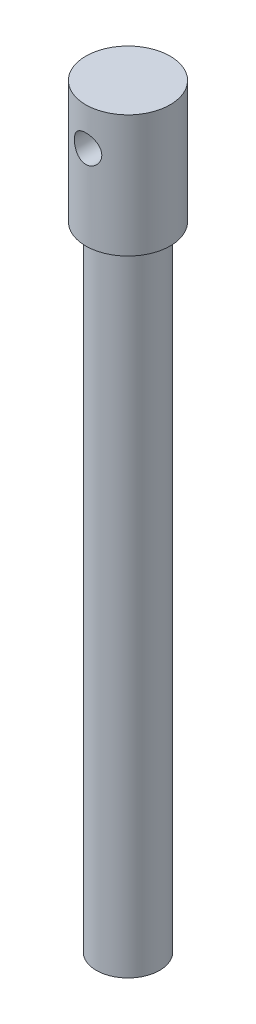
ISO-10303-21;
HEADER;
FILE_DESCRIPTION(('STEP AP214'),'2;1');
FILE_NAME('part.step','',(''),(''),'','','');
FILE_SCHEMA(('AUTOMOTIVE_DESIGN { 1 0 10303 214 1 1 1 1 }'));
ENDSEC;
DATA;
#1=APPLICATION_CONTEXT('core data for automotive mechanical design processes');
#2=APPLICATION_PROTOCOL_DEFINITION('international standard','automotive_design',2000,#1);
#3=PRODUCT_CONTEXT('',#1,'mechanical');
#4=PRODUCT('Part','Part','',(#3));
#5=PRODUCT_RELATED_PRODUCT_CATEGORY('part','',(#4));
#6=PRODUCT_DEFINITION_FORMATION('','',#4);
#7=PRODUCT_DEFINITION_CONTEXT('part definition',#1,'design');
#8=PRODUCT_DEFINITION('design','',#6,#7);
#9=PRODUCT_DEFINITION_SHAPE('','',#8);
#10=(LENGTH_UNIT() NAMED_UNIT(*) SI_UNIT(.MILLI.,.METRE.));
#11=(NAMED_UNIT(*) PLANE_ANGLE_UNIT() SI_UNIT($,.RADIAN.));
#12=(NAMED_UNIT(*) SI_UNIT($,.STERADIAN.) SOLID_ANGLE_UNIT());
#13=UNCERTAINTY_MEASURE_WITH_UNIT(LENGTH_MEASURE(1.E-05),#10,'distance_accuracy_value','');
#14=(GEOMETRIC_REPRESENTATION_CONTEXT(3) GLOBAL_UNCERTAINTY_ASSIGNED_CONTEXT((#13)) GLOBAL_UNIT_ASSIGNED_CONTEXT((#10,
#11,#12)) REPRESENTATION_CONTEXT('',''));
#15=CARTESIAN_POINT('',(0.,0.,0.));
#16=DIRECTION('',(0.,0.,1.));
#17=DIRECTION('',(1.,0.,0.));
#18=AXIS2_PLACEMENT_3D('',#15,#16,#17);
#19=CARTESIAN_POINT('',(0.,150.,0.));
#20=DIRECTION('',(0.,-1.,0.));
#21=DIRECTION('',(0.,0.,-1.));
#22=AXIS2_PLACEMENT_3D('',#19,#20,#21);
#23=CYLINDRICAL_SURFACE('',#22,7.5);
#24=CARTESIAN_POINT('',(0.,150.,0.));
#25=DIRECTION('',(0.,1.,0.));
#26=DIRECTION('',(0.,0.,1.));
#27=AXIS2_PLACEMENT_3D('',#24,#25,#26);
#28=CIRCLE('',#27,7.5);
#29=CARTESIAN_POINT('',(0.,150.,7.5));
#30=VERTEX_POINT('',#29);
#31=EDGE_CURVE('E54',#30,#30,#28,.T.);
#32=ORIENTED_EDGE('',*,*,#31,.F.);
#33=EDGE_LOOP('',(#32));
#34=FACE_BOUND('',#33,.T.);
#35=CARTESIAN_POINT('',(0.,0.,0.));
#36=DIRECTION('',(0.,1.,0.));
#37=DIRECTION('',(0.,0.,1.));
#38=AXIS2_PLACEMENT_3D('',#35,#36,#37);
#39=CIRCLE('',#38,7.5);
#40=CARTESIAN_POINT('',(0.,0.,7.5));
#41=VERTEX_POINT('',#40);
#42=EDGE_CURVE('E59',#41,#41,#39,.T.);
#43=ORIENTED_EDGE('',*,*,#42,.T.);
#44=EDGE_LOOP('',(#43));
#45=FACE_BOUND('',#44,.T.);
#46=ADVANCED_FACE('F37',(#34,#45),#23,.T.);
#47=CARTESIAN_POINT('',(0.,0.,0.));
#48=DIRECTION('',(0.,1.,0.));
#49=DIRECTION('',(0.,0.,1.));
#50=AXIS2_PLACEMENT_3D('',#47,#48,#49);
#51=PLANE('',#50);
#52=ORIENTED_EDGE('',*,*,#42,.F.);
#53=EDGE_LOOP('',(#52));
#54=FACE_BOUND('',#53,.T.);
#55=ADVANCED_FACE('F84',(#54),#51,.F.);
#56=CARTESIAN_POINT('',(0.,179.,0.));
#57=DIRECTION('',(0.,-1.,0.));
#58=DIRECTION('',(0.,0.,-1.));
#59=AXIS2_PLACEMENT_3D('',#56,#57,#58);
#60=CYLINDRICAL_SURFACE('',#59,10.);
#61=CARTESIAN_POINT('',(0.,173.25,-10.));
#62=CARTESIAN_POINT('',(-0.177579382949032,173.249999978893,-9.99999989374565));
#63=CARTESIAN_POINT('',(-0.355160799428106,173.235398036528,-9.99522579386108));
#64=CARTESIAN_POINT('',(-0.705108112257457,173.177544333272,-9.97665017824228));
#65=CARTESIAN_POINT('',(-0.877473205641293,173.134288184761,-9.96284727999529));
#66=CARTESIAN_POINT('',(-1.21189182680223,173.020754772825,-9.92771716006863));
#67=CARTESIAN_POINT('',(-1.37396158278686,172.950521329808,-9.90640214525769));
#68=CARTESIAN_POINT('',(-1.68402262402101,172.785220348216,-9.85843361438871));
#69=CARTESIAN_POINT('',(-1.83201134569424,172.690148299311,-9.83177912896556));
#70=CARTESIAN_POINT('',(-2.11461081148199,172.474558938708,-9.77495932247796));
#71=CARTESIAN_POINT('',(-2.24869037174637,172.353366806204,-9.74471295358528));
#72=CARTESIAN_POINT('',(-2.49502344091046,172.090413033913,-9.6845736848256));
#73=CARTESIAN_POINT('',(-2.6072724549812,171.94864716854,-9.65468085893924));
#74=CARTESIAN_POINT('',(-2.80972801137824,171.643862973249,-9.59775056049016));
#75=CARTESIAN_POINT('',(-2.89925504445897,171.480372950202,-9.57081237727236));
#76=CARTESIAN_POINT('',(-3.04931887139799,171.139640099792,-9.52406830823476));
#77=CARTESIAN_POINT('',(-3.10986401524674,170.962401250734,-9.50426036852438));
#78=CARTESIAN_POINT('',(-3.19827260971519,170.605224003478,-9.4748706234853));
#79=CARTESIAN_POINT('',(-3.2271274104268,170.425557170357,-9.46497952226558));
#80=CARTESIAN_POINT('',(-3.25443459132067,170.063681042994,-9.45562707493594));
#81=CARTESIAN_POINT('',(-3.25289582251765,169.881472504376,-9.45616269242515));
#82=CARTESIAN_POINT('',(-3.22023155138037,169.528034921642,-9.46733131423128));
#83=CARTESIAN_POINT('',(-3.19038591816139,169.356671424264,-9.47752750417875));
#84=CARTESIAN_POINT('',(-3.10403782395807,169.021530266182,-9.50615574812356));
#85=CARTESIAN_POINT('',(-3.04753231830217,168.85775347426,-9.52458874278654));
#86=CARTESIAN_POINT('',(-2.9086040418874,168.539469725231,-9.56793440052134));
#87=CARTESIAN_POINT('',(-2.82579288678077,168.385145941743,-9.5929431291382));
#88=CARTESIAN_POINT('',(-2.63687365185911,168.092174070327,-9.64658062480913));
#89=CARTESIAN_POINT('',(-2.53075911343128,167.953530344352,-9.6752103945125));
#90=CARTESIAN_POINT('',(-2.2920440655438,167.688644194671,-9.73459644737762));
#91=CARTESIAN_POINT('',(-2.15839298888212,167.56335456075,-9.76538786414675));
#92=CARTESIAN_POINT('',(-1.87159594889806,167.336724933833,-9.82438470108507));
#93=CARTESIAN_POINT('',(-1.71844829781996,167.235387016431,-9.85258989700937));
#94=CARTESIAN_POINT('',(-1.39505996296229,167.058820419637,-9.90357541398692));
#95=CARTESIAN_POINT('',(-1.22467751353945,166.983835581401,-9.92630448856869));
#96=CARTESIAN_POINT('',(-0.872803501369046,166.863882450901,-9.96340575158467));
#97=CARTESIAN_POINT('',(-0.691315620659405,166.818904268084,-9.97778069343973));
#98=CARTESIAN_POINT('',(-0.330457295677715,166.761902689586,-9.99610319938068));
#99=CARTESIAN_POINT('',(-0.151310774152583,166.748590876142,-10.0004581918424));
#100=CARTESIAN_POINT('',(0.206684753642988,166.751644995372,-9.99946515119833));
#101=CARTESIAN_POINT('',(0.385533802797548,166.76800619627,-9.99411866512874));
#102=CARTESIAN_POINT('',(0.732777014929084,166.828916125414,-9.97459190888947));
#103=CARTESIAN_POINT('',(0.901323284372867,166.872683874118,-9.96065655544012));
#104=CARTESIAN_POINT('',(1.22862125569252,166.986197639871,-9.92560343144515));
#105=CARTESIAN_POINT('',(1.38737171915065,167.05594693378,-9.90448475494932));
#106=CARTESIAN_POINT('',(1.69509055480489,167.221427270234,-9.85654869030636));
#107=CARTESIAN_POINT('',(1.84370519348155,167.317776824875,-9.82959944293602));
#108=CARTESIAN_POINT('',(2.12308150730876,167.532989903973,-9.77306882676684));
#109=CARTESIAN_POINT('',(2.25383795390918,167.651859997817,-9.74348669127606));
#110=CARTESIAN_POINT('',(2.49964097258612,167.914800978044,-9.68341394517995));
#111=CARTESIAN_POINT('',(2.61376838975717,168.059736741237,-9.65293908057768));
#112=CARTESIAN_POINT('',(2.81618275812033,168.367361002655,-9.59584349220032));
#113=CARTESIAN_POINT('',(2.90446977360854,168.530049456706,-9.56922275883548));
#114=CARTESIAN_POINT('',(3.05222465357593,168.868452539395,-9.52312626728825));
#115=CARTESIAN_POINT('',(3.11177462835522,169.044128380463,-9.50363019104654));
#116=CARTESIAN_POINT('',(3.20020095668876,169.403787781573,-9.47422438151486));
#117=CARTESIAN_POINT('',(3.22909023717128,169.587767806332,-9.4643106083648));
#118=CARTESIAN_POINT('',(3.25439854839942,169.949140117443,-9.45563586870717));
#119=CARTESIAN_POINT('',(3.25233581624124,170.126414793097,-9.45635339998916));
#120=CARTESIAN_POINT('',(3.21950614466645,170.477953996167,-9.46758016662914));
#121=CARTESIAN_POINT('',(3.18874075712544,170.652218685805,-9.47808887260453));
#122=CARTESIAN_POINT('',(3.10043070730134,170.989832105728,-9.50733511912922));
#123=CARTESIAN_POINT('',(3.04335434275121,171.153316786779,-9.52592844913926));
#124=CARTESIAN_POINT('',(2.90441722996808,171.468517175449,-9.5692021691022));
#125=CARTESIAN_POINT('',(2.82255115849537,171.620230346504,-9.59388386623479));
#126=CARTESIAN_POINT('',(2.63235879697991,171.914456183463,-9.64784088636398));
#127=CARTESIAN_POINT('',(2.52306891129122,172.056318521375,-9.67726517521805));
#128=CARTESIAN_POINT('',(2.28278717900074,172.320180906983,-9.73674387050348));
#129=CARTESIAN_POINT('',(2.15178933442871,172.442175446629,-9.76679844907542));
#130=CARTESIAN_POINT('',(1.86608754817448,172.667296798218,-9.8254625209376));
#131=CARTESIAN_POINT('',(1.71069498742677,172.769576588143,-9.85397977542082));
#132=CARTESIAN_POINT('',(1.38400159009727,172.946440653677,-9.90514098282108));
#133=CARTESIAN_POINT('',(1.21270574929997,173.021033590156,-9.92778677175249));
#134=CARTESIAN_POINT('',(0.869832380696085,173.13633303599,-9.96349655119001));
#135=CARTESIAN_POINT('',(0.698908003473866,173.178827389201,-9.97706030755102));
#136=CARTESIAN_POINT('',(0.351988917437697,173.235657443572,-9.9953110007797));
#137=CARTESIAN_POINT('',(0.175995457426619,173.250000020918,-10.0000001053066));
#138=CARTESIAN_POINT('',(0.,173.25,-10.));
#139=B_SPLINE_CURVE_WITH_KNOTS('',3,(#61,#62,#63,#64,#65,#66,#67,#68,#69,#70,#71,#72,#73,#74,
#75,#76,#77,#78,#79,#80,#81,#82,#83,#84,#85,#86,#87,#88,#89,#90,#91,#92,#93,#94,#95,#96,#97,#98,
#99,#100,#101,#102,#103,#104,#105,#106,#107,#108,#109,#110,#111,#112,#113,#114,#115,#116,#117,
#118,#119,#120,#121,#122,#123,#124,#125,#126,#127,#128,#129,#130,#131,#132,#133,#134,#135,#136,
#137,#138),.UNSPECIFIED.,.T.,.F.,(4,2,2,2,2,2,2,2,2,2,2,2,2,2,2,2,2,2,2,2,2,2,2,2,2,2,2,2,2,2,2,
2,2,2,2,2,2,2,4),(0.,0.532090801254672,1.06426309669592,1.59557459199055,2.12698263287681,
2.67425296309555,3.22163585524027,3.78384740278183,4.34589687356042,4.8898136818771,
5.43357209666658,5.95386117923413,6.47420969543026,7.00262882865678,7.53119460031026,
8.08590846442155,8.64067038102188,9.20043805582591,9.76002113320908,10.2964148728263,
10.8327230844865,11.3544036147969,11.8761499631049,12.4112318399367,12.9464700445872,
13.5047604456698,14.0630494576023,14.6197336846483,15.176183113382,15.7054311330745,
16.2346505394039,16.7547941299287,17.275049493252,17.8170673976499,18.3592353135956,
18.9211107593865,19.4828102935623,20.0102839458812,20.5376287446081),.UNSPECIFIED.);
#140=CARTESIAN_POINT('',(0.,173.25,-10.));
#141=VERTEX_POINT('',#140);
#142=EDGE_CURVE('E10',#141,#141,#139,.T.);
#143=ORIENTED_EDGE('',*,*,#142,.T.);
#144=EDGE_LOOP('',(#143));
#145=FACE_BOUND('',#144,.T.);
#146=CARTESIAN_POINT('',(3.25,170.,9.45714015968887));
#147=CARTESIAN_POINT('',(3.24999996594421,169.822700469016,9.45714031975425));
#148=CARTESIAN_POINT('',(3.23544233910947,169.645398920942,9.46218061553846));
#149=CARTESIAN_POINT('',(3.17778063387206,169.296030767562,9.48169889974066));
#150=CARTESIAN_POINT('',(3.13467065672283,169.123965251675,9.49617883832328));
#151=CARTESIAN_POINT('',(3.0215640876378,168.790183882034,9.53276684736511));
#152=CARTESIAN_POINT('',(2.95161808731896,168.62844921766,9.55486055631606));
#153=CARTESIAN_POINT('',(2.78699619388974,168.31896071185,9.60416619680663));
#154=CARTESIAN_POINT('',(2.6923152745147,168.171209720292,9.63137916829215));
#155=CARTESIAN_POINT('',(2.47714104411861,167.88838979786,9.68899176574426));
#156=CARTESIAN_POINT('',(2.35588471696471,167.753916828891,9.71946792284961));
#157=CARTESIAN_POINT('',(2.09263184494553,167.506811032875,9.77952436884652));
#158=CARTESIAN_POINT('',(1.95063215712303,167.394181521498,9.8091045211573));
#159=CARTESIAN_POINT('',(1.64559602796292,167.191285994057,9.86491782280745));
#160=CARTESIAN_POINT('',(1.48212711806988,167.10164006186,9.89105042825693));
#161=CARTESIAN_POINT('',(1.14143632793765,166.951351038121,9.9361257418338));
#162=CARTESIAN_POINT('',(0.964217973560261,166.890700539472,9.95507028595169));
#163=CARTESIAN_POINT('',(0.607303975463901,166.802132320943,9.98309301263069));
#164=CARTESIAN_POINT('',(0.427885967277248,166.773194618689,9.99247790860663));
#165=CARTESIAN_POINT('',(0.0665120376229172,166.745634914373,10.0014104232845));
#166=CARTESIAN_POINT('',(-0.11544325027622,166.747005475044,10.0009604553388));
#167=CARTESIAN_POINT('',(-0.469523771450094,166.779366642777,9.99048411795756));
#168=CARTESIAN_POINT('',(-0.641762482940381,166.809250275205,9.98081565195022));
#169=CARTESIAN_POINT('',(-0.978632246401636,166.895964508267,9.95343429447757));
#170=CARTESIAN_POINT('',(-1.14326278907264,166.952796910025,9.93572086532967));
#171=CARTESIAN_POINT('',(-1.46271759756168,167.0924678862,9.89377411201859));
#172=CARTESIAN_POINT('',(-1.61738943124249,167.175629920903,9.869460261881));
#173=CARTESIAN_POINT('',(-1.91091693128668,167.365335895122,9.81685615924599));
#174=CARTESIAN_POINT('',(-2.04976834129097,167.471886104582,9.78856484119447));
#175=CARTESIAN_POINT('',(-2.3143054938457,167.710965327332,9.72950106071725));
#176=CARTESIAN_POINT('',(-2.43912040936661,167.844445830716,9.69867422994171));
#177=CARTESIAN_POINT('',(-2.66486690355387,168.130717090519,9.63909486372543));
#178=CARTESIAN_POINT('',(-2.76579516980328,168.283510520605,9.61034261635581));
#179=CARTESIAN_POINT('',(-2.94202938013299,168.60670747249,9.55787955588513));
#180=CARTESIAN_POINT('',(-3.01698630603797,168.777313558039,9.53423890921103));
#181=CARTESIAN_POINT('',(-3.13682094119598,169.129684677087,9.49549194347806));
#182=CARTESIAN_POINT('',(-3.18171051560576,169.311445277853,9.48038225830742));
#183=CARTESIAN_POINT('',(-3.23840120551587,169.672567539479,9.46116378995736));
#184=CARTESIAN_POINT('',(-3.25154577533661,169.851694623132,9.45660869381158));
#185=CARTESIAN_POINT('',(-3.24816506242597,170.20961630173,9.45777099529463));
#186=CARTESIAN_POINT('',(-3.23164483295112,170.38841094811,9.46348664335148));
#187=CARTESIAN_POINT('',(-3.17060807190336,170.734615900338,9.48410320755962));
#188=CARTESIAN_POINT('',(-3.12700704786871,170.902207412356,9.49870345169874));
#189=CARTESIAN_POINT('',(-3.0141352607906,171.227668440678,9.53511831835135));
#190=CARTESIAN_POINT('',(-2.94486009149767,171.385536282761,9.55693417915462));
#191=CARTESIAN_POINT('',(-2.78020029035673,171.692403165633,9.60614721606396));
#192=CARTESIAN_POINT('',(-2.68408357895598,171.840984695724,9.63369436385389));
#193=CARTESIAN_POINT('',(-2.46930881957964,172.12039723434,9.69096725740347));
#194=CARTESIAN_POINT('',(-2.35064444508002,172.251223243238,9.7206936131738));
#195=CARTESIAN_POINT('',(-2.08774508026599,172.497540934122,9.780607139663));
#196=CARTESIAN_POINT('',(-1.9425942297594,172.612067629134,9.81075403007331));
#197=CARTESIAN_POINT('',(-1.63439731618792,172.815190562723,9.86677456184763));
#198=CARTESIAN_POINT('',(-1.4713519739419,172.903787845251,9.89264837523296));
#199=CARTESIAN_POINT('',(-1.13289346303606,173.051706051547,9.93707445650379));
#200=CARTESIAN_POINT('',(-0.957574938068041,173.111227721038,9.95567674524018));
#201=CARTESIAN_POINT('',(-0.598697534609169,173.199716424584,9.98368172068449));
#202=CARTESIAN_POINT('',(-0.41514149039895,173.228693885208,9.99308754661659));
#203=CARTESIAN_POINT('',(-0.0538483383324283,173.254369926047,10.0014145744501));
#204=CARTESIAN_POINT('',(0.123780796472706,173.252457158868,10.0007868427667));
#205=CARTESIAN_POINT('',(0.476070007471454,173.219805120565,9.99021560869602));
#206=CARTESIAN_POINT('',(0.650730303811719,173.189067996417,9.98027280013975));
#207=CARTESIAN_POINT('',(0.989620887576098,173.100546781738,9.95234501872029));
#208=CARTESIAN_POINT('',(1.15396550686855,173.043160393528,9.93447846708206));
#209=CARTESIAN_POINT('',(1.47076416800395,172.903333879493,9.8925433503312));
#210=CARTESIAN_POINT('',(1.62321609265709,172.820889305434,9.86847368418031));
#211=CARTESIAN_POINT('',(1.91784189154065,172.629885547409,9.81555378161621));
#212=CARTESIAN_POINT('',(2.05945312297859,172.520497792389,9.78656335044512));
#213=CARTESIAN_POINT('',(2.32276630111766,172.280143094872,9.72743554627142));
#214=CARTESIAN_POINT('',(2.44446203257076,172.149169441325,9.69729781882271));
#215=CARTESIAN_POINT('',(2.66901287727713,171.863612189025,9.63796513947998));
#216=CARTESIAN_POINT('',(2.77101345238617,171.708338927469,9.60884528614324));
#217=CARTESIAN_POINT('',(2.9473830347498,171.381959056859,9.55622558839879));
#218=CARTESIAN_POINT('',(3.02176091768746,171.210857555823,9.53272393962414));
#219=CARTESIAN_POINT('',(3.13669494452506,170.868457915895,9.49550334814008));
#220=CARTESIAN_POINT('',(3.17905105398648,170.697820090796,9.48127131053795));
#221=CARTESIAN_POINT('',(3.23569936279266,170.351454469118,9.46209103822373));
#222=CARTESIAN_POINT('',(3.25000003375398,170.175728225307,9.45714000104206));
#223=CARTESIAN_POINT('',(3.25,170.,9.45714015968887));
#224=B_SPLINE_CURVE_WITH_KNOTS('',3,(#146,#147,#148,#149,#150,#151,#152,#153,#154,#155,#156,
#157,#158,#159,#160,#161,#162,#163,#164,#165,#166,#167,#168,#169,#170,#171,#172,#173,#174,#175,
#176,#177,#178,#179,#180,#181,#182,#183,#184,#185,#186,#187,#188,#189,#190,#191,#192,#193,#194,
#195,#196,#197,#198,#199,#200,#201,#202,#203,#204,#205,#206,#207,#208,#209,#210,#211,#212,#213,
#214,#215,#216,#217,#218,#219,#220,#221,#222,#223),.UNSPECIFIED.,.T.,.F.,(4,2,2,2,2,2,2,2,2,2,2,
2,2,2,2,2,2,2,2,2,2,2,2,2,2,2,2,2,2,2,2,2,2,2,2,2,2,2,4),(0.,0.531248505037176,1.06260679711989,
1.5929682491144,2.12343755726669,2.6718018854672,3.22024938614486,3.78222372984983,
4.34405443604301,4.8872302974321,5.43027287176747,5.95305557209683,6.47587321758636,
7.00538064397249,7.53503019539515,8.08845610905502,8.64195872265877,9.2026347459513,
9.76308938511452,10.2993744444867,10.8355681589329,11.3545536787973,11.8736283092985,
12.4085390846316,12.9436001698434,13.502936415514,14.0622501384863,14.6176456234264,
15.1728514571605,15.7031706450783,16.2334503354496,16.7560588347683,17.2787601598331,
17.8201569265528,18.3617223320029,18.9231471315415,19.4843913784857,20.0110907944364,
20.5376311438056),.UNSPECIFIED.);
#225=CARTESIAN_POINT('',(3.25,170.,9.45714015968887));
#226=VERTEX_POINT('',#225);
#227=EDGE_CURVE('E49',#226,#226,#224,.T.);
#228=ORIENTED_EDGE('',*,*,#227,.T.);
#229=EDGE_LOOP('',(#228));
#230=FACE_BOUND('',#229,.T.);
#231=CARTESIAN_POINT('',(0.,179.,0.));
#232=DIRECTION('',(0.,1.,0.));
#233=DIRECTION('',(0.,0.,1.));
#234=AXIS2_PLACEMENT_3D('',#231,#232,#233);
#235=CIRCLE('',#234,10.);
#236=CARTESIAN_POINT('',(0.,179.,10.));
#237=VERTEX_POINT('',#236);
#238=EDGE_CURVE('E95',#237,#237,#235,.T.);
#239=ORIENTED_EDGE('',*,*,#238,.F.);
#240=EDGE_LOOP('',(#239));
#241=FACE_BOUND('',#240,.T.);
#242=CARTESIAN_POINT('',(0.,150.,0.));
#243=DIRECTION('',(0.,1.,0.));
#244=DIRECTION('',(0.,0.,1.));
#245=AXIS2_PLACEMENT_3D('',#242,#243,#244);
#246=CIRCLE('',#245,10.);
#247=CARTESIAN_POINT('',(0.,150.,10.));
#248=VERTEX_POINT('',#247);
#249=EDGE_CURVE('E98',#248,#248,#246,.T.);
#250=ORIENTED_EDGE('',*,*,#249,.T.);
#251=EDGE_LOOP('',(#250));
#252=FACE_BOUND('',#251,.T.);
#253=ADVANCED_FACE('F65',(#145,#230,#241,#252),#60,.T.);
#254=CARTESIAN_POINT('',(0.,179.,0.));
#255=DIRECTION('',(0.,1.,0.));
#256=DIRECTION('',(0.,0.,1.));
#257=AXIS2_PLACEMENT_3D('',#254,#255,#256);
#258=PLANE('',#257);
#259=ORIENTED_EDGE('',*,*,#238,.T.);
#260=EDGE_LOOP('',(#259));
#261=FACE_BOUND('',#260,.T.);
#262=ADVANCED_FACE('F74',(#261),#258,.T.);
#263=CARTESIAN_POINT('',(0.,150.,0.));
#264=DIRECTION('',(0.,1.,0.));
#265=DIRECTION('',(0.,0.,1.));
#266=AXIS2_PLACEMENT_3D('',#263,#264,#265);
#267=PLANE('',#266);
#268=ORIENTED_EDGE('',*,*,#31,.T.);
#269=EDGE_LOOP('',(#268));
#270=FACE_BOUND('',#269,.T.);
#271=ORIENTED_EDGE('',*,*,#249,.F.);
#272=EDGE_LOOP('',(#271));
#273=FACE_BOUND('',#272,.T.);
#274=ADVANCED_FACE('F72',(#270,#273),#267,.F.);
#275=CARTESIAN_POINT('',(0.,170.,-10.));
#276=DIRECTION('',(0.,0.,1.));
#277=DIRECTION('',(1.,0.,0.));
#278=AXIS2_PLACEMENT_3D('',#275,#276,#277);
#279=CYLINDRICAL_SURFACE('',#278,3.25);
#280=ORIENTED_EDGE('',*,*,#227,.F.);
#281=EDGE_LOOP('',(#280));
#282=FACE_BOUND('',#281,.T.);
#283=ORIENTED_EDGE('',*,*,#142,.F.);
#284=EDGE_LOOP('',(#283));
#285=FACE_BOUND('',#284,.T.);
#286=ADVANCED_FACE('F68',(#282,#285),#279,.F.);
#287=CLOSED_SHELL('',(#46,#55,#253,#262,#274,#286));
#288=MANIFOLD_SOLID_BREP('B2',#287);
#289=ADVANCED_BREP_SHAPE_REPRESENTATION('',(#18,#288),#14);
#290=SHAPE_DEFINITION_REPRESENTATION(#9,#289);
ENDSEC;
END-ISO-10303-21;
